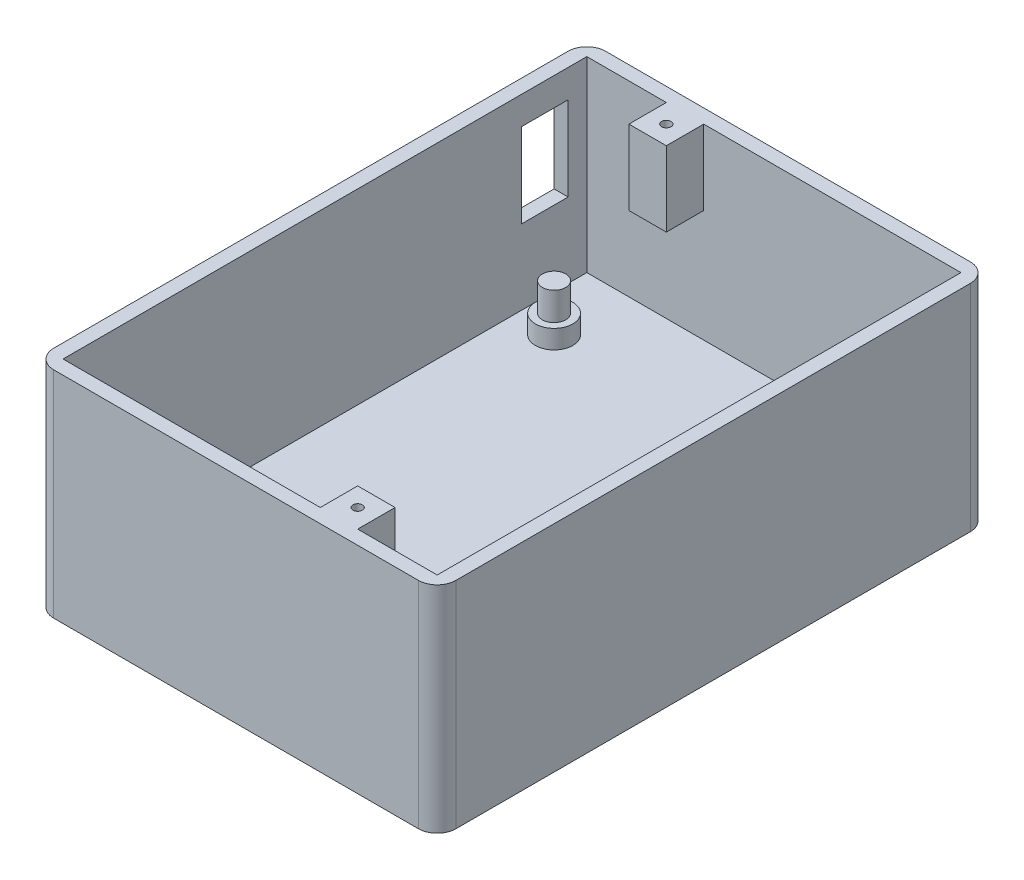
ISO-10303-21;
HEADER;
FILE_DESCRIPTION(('STEP AP214'),'2;1');
FILE_NAME('part.step','',(''),(''),'','','');
FILE_SCHEMA(('AUTOMOTIVE_DESIGN { 1 0 10303 214 1 1 1 1 }'));
ENDSEC;
DATA;
#1=APPLICATION_CONTEXT('core data for automotive mechanical design processes');
#2=APPLICATION_PROTOCOL_DEFINITION('international standard','automotive_design',2000,#1);
#3=PRODUCT_CONTEXT('',#1,'mechanical');
#4=PRODUCT('Part','Part','',(#3));
#5=PRODUCT_RELATED_PRODUCT_CATEGORY('part','',(#4));
#6=PRODUCT_DEFINITION_FORMATION('','',#4);
#7=PRODUCT_DEFINITION_CONTEXT('part definition',#1,'design');
#8=PRODUCT_DEFINITION('design','',#6,#7);
#9=PRODUCT_DEFINITION_SHAPE('','',#8);
#10=(LENGTH_UNIT() NAMED_UNIT(*) SI_UNIT(.MILLI.,.METRE.));
#11=(NAMED_UNIT(*) PLANE_ANGLE_UNIT() SI_UNIT($,.RADIAN.));
#12=(NAMED_UNIT(*) SI_UNIT($,.STERADIAN.) SOLID_ANGLE_UNIT());
#13=UNCERTAINTY_MEASURE_WITH_UNIT(LENGTH_MEASURE(1.E-05),#10,'distance_accuracy_value','');
#14=(GEOMETRIC_REPRESENTATION_CONTEXT(3) GLOBAL_UNCERTAINTY_ASSIGNED_CONTEXT((#13)) GLOBAL_UNIT_ASSIGNED_CONTEXT((#10,
#11,#12)) REPRESENTATION_CONTEXT('',''));
#15=CARTESIAN_POINT('',(0.,0.,0.));
#16=DIRECTION('',(0.,0.,1.));
#17=DIRECTION('',(1.,0.,0.));
#18=AXIS2_PLACEMENT_3D('',#15,#16,#17);
#19=CARTESIAN_POINT('',(-20.,3.,28.));
#20=DIRECTION('',(0.,0.,1.));
#21=DIRECTION('',(1.,0.,0.));
#22=AXIS2_PLACEMENT_3D('',#19,#20,#21);
#23=PLANE('',#22);
#24=DIRECTION('',(0.,-1.,0.));
#25=VECTOR('',#24,1.);
#26=CARTESIAN_POINT('',(11.5,23.,28.));
#27=LINE('',#26,#25);
#28=CARTESIAN_POINT('',(11.5,23.,28.));
#29=VERTEX_POINT('',#28);
#30=CARTESIAN_POINT('',(11.5,15.,28.));
#31=VERTEX_POINT('',#30);
#32=EDGE_CURVE('E227',#29,#31,#27,.T.);
#33=ORIENTED_EDGE('',*,*,#32,.F.);
#34=DIRECTION('',(1.,0.,0.));
#35=VECTOR('',#34,1.);
#36=CARTESIAN_POINT('',(-20.,23.,28.));
#37=LINE('',#36,#35);
#38=CARTESIAN_POINT('',(20.,23.,28.));
#39=VERTEX_POINT('',#38);
#40=EDGE_CURVE('E329',#29,#39,#37,.T.);
#41=ORIENTED_EDGE('',*,*,#40,.T.);
#42=DIRECTION('',(0.,1.,0.));
#43=VECTOR('',#42,1.);
#44=CARTESIAN_POINT('',(20.,3.,28.));
#45=LINE('',#44,#43);
#46=CARTESIAN_POINT('',(20.,3.,28.));
#47=VERTEX_POINT('',#46);
#48=EDGE_CURVE('E343',#47,#39,#45,.T.);
#49=ORIENTED_EDGE('',*,*,#48,.F.);
#50=DIRECTION('',(1.,0.,0.));
#51=VECTOR('',#50,1.);
#52=CARTESIAN_POINT('',(-20.,3.,28.));
#53=LINE('',#52,#51);
#54=CARTESIAN_POINT('',(-20.,3.,28.));
#55=VERTEX_POINT('',#54);
#56=EDGE_CURVE('E317',#55,#47,#53,.T.);
#57=ORIENTED_EDGE('',*,*,#56,.F.);
#58=DIRECTION('',(0.,1.,0.));
#59=VECTOR('',#58,1.);
#60=CARTESIAN_POINT('',(-20.,3.,28.));
#61=LINE('',#60,#59);
#62=CARTESIAN_POINT('',(-20.,23.,28.));
#63=VERTEX_POINT('',#62);
#64=EDGE_CURVE('E327',#55,#63,#61,.T.);
#65=ORIENTED_EDGE('',*,*,#64,.T.);
#66=CARTESIAN_POINT('',(7.5,23.,28.));
#67=VERTEX_POINT('',#66);
#68=EDGE_CURVE('E330',#63,#67,#37,.T.);
#69=ORIENTED_EDGE('',*,*,#68,.T.);
#70=DIRECTION('',(0.,1.,0.));
#71=VECTOR('',#70,1.);
#72=CARTESIAN_POINT('',(7.5,23.,28.));
#73=LINE('',#72,#71);
#74=CARTESIAN_POINT('',(7.5,15.,28.));
#75=VERTEX_POINT('',#74);
#76=EDGE_CURVE('E234',#75,#67,#73,.T.);
#77=ORIENTED_EDGE('',*,*,#76,.F.);
#78=DIRECTION('',(-1.,0.,0.));
#79=VECTOR('',#78,1.);
#80=CARTESIAN_POINT('',(11.5,15.,28.));
#81=LINE('',#80,#79);
#82=EDGE_CURVE('E243',#31,#75,#81,.T.);
#83=ORIENTED_EDGE('',*,*,#82,.F.);
#84=EDGE_LOOP('',(#33,#41,#49,#57,#65,#69,#77,#83));
#85=FACE_BOUND('',#84,.T.);
#86=ADVANCED_FACE('F32',(#85),#23,.F.);
#87=CARTESIAN_POINT('',(-20.,3.,-28.));
#88=DIRECTION('',(0.,0.,-1.));
#89=DIRECTION('',(-1.,0.,0.));
#90=AXIS2_PLACEMENT_3D('',#87,#88,#89);
#91=PLANE('',#90);
#92=DIRECTION('',(0.,-1.,0.));
#93=VECTOR('',#92,1.);
#94=CARTESIAN_POINT('',(-11.5,23.,-28.));
#95=LINE('',#94,#93);
#96=CARTESIAN_POINT('',(-11.5,23.,-28.));
#97=VERTEX_POINT('',#96);
#98=CARTESIAN_POINT('',(-11.5,15.,-28.));
#99=VERTEX_POINT('',#98);
#100=EDGE_CURVE('E259',#97,#99,#95,.T.);
#101=ORIENTED_EDGE('',*,*,#100,.F.);
#102=DIRECTION('',(-1.,0.,0.));
#103=VECTOR('',#102,1.);
#104=CARTESIAN_POINT('',(-20.,23.,-28.));
#105=LINE('',#104,#103);
#106=CARTESIAN_POINT('',(-20.,23.,-28.));
#107=VERTEX_POINT('',#106);
#108=EDGE_CURVE('E335',#97,#107,#105,.T.);
#109=ORIENTED_EDGE('',*,*,#108,.T.);
#110=DIRECTION('',(0.,1.,0.));
#111=VECTOR('',#110,1.);
#112=CARTESIAN_POINT('',(-20.,3.,-28.));
#113=LINE('',#112,#111);
#114=CARTESIAN_POINT('',(-20.,3.,-28.));
#115=VERTEX_POINT('',#114);
#116=EDGE_CURVE('E337',#115,#107,#113,.T.);
#117=ORIENTED_EDGE('',*,*,#116,.F.);
#118=DIRECTION('',(-1.,0.,0.));
#119=VECTOR('',#118,1.);
#120=CARTESIAN_POINT('',(-20.,3.,-28.));
#121=LINE('',#120,#119);
#122=CARTESIAN_POINT('',(20.,3.,-28.));
#123=VERTEX_POINT('',#122);
#124=EDGE_CURVE('E324',#123,#115,#121,.T.);
#125=ORIENTED_EDGE('',*,*,#124,.F.);
#126=DIRECTION('',(0.,1.,0.));
#127=VECTOR('',#126,1.);
#128=CARTESIAN_POINT('',(20.,3.,-28.));
#129=LINE('',#128,#127);
#130=CARTESIAN_POINT('',(20.,23.,-28.));
#131=VERTEX_POINT('',#130);
#132=EDGE_CURVE('E341',#123,#131,#129,.T.);
#133=ORIENTED_EDGE('',*,*,#132,.T.);
#134=CARTESIAN_POINT('',(-7.5,23.,-28.));
#135=VERTEX_POINT('',#134);
#136=EDGE_CURVE('E318',#131,#135,#105,.T.);
#137=ORIENTED_EDGE('',*,*,#136,.T.);
#138=DIRECTION('',(0.,1.,0.));
#139=VECTOR('',#138,1.);
#140=CARTESIAN_POINT('',(-7.5,23.,-28.));
#141=LINE('',#140,#139);
#142=CARTESIAN_POINT('',(-7.5,15.,-28.));
#143=VERTEX_POINT('',#142);
#144=EDGE_CURVE('E264',#143,#135,#141,.T.);
#145=ORIENTED_EDGE('',*,*,#144,.F.);
#146=DIRECTION('',(1.,0.,0.));
#147=VECTOR('',#146,1.);
#148=CARTESIAN_POINT('',(-11.5,15.,-28.));
#149=LINE('',#148,#147);
#150=EDGE_CURVE('E273',#99,#143,#149,.T.);
#151=ORIENTED_EDGE('',*,*,#150,.F.);
#152=EDGE_LOOP('',(#101,#109,#117,#125,#133,#137,#145,#151));
#153=FACE_BOUND('',#152,.T.);
#154=ADVANCED_FACE('F449',(#153),#91,.F.);
#155=CARTESIAN_POINT('',(19.5,23.,-27.5));
#156=DIRECTION('',(0.,-1.,0.));
#157=DIRECTION('',(0.,0.,-1.));
#158=AXIS2_PLACEMENT_3D('',#155,#156,#157);
#159=CYLINDRICAL_SURFACE('',#158,2.);
#160=CARTESIAN_POINT('',(19.5,0.,-27.5));
#161=DIRECTION('',(0.,1.,0.));
#162=DIRECTION('',(0.,0.,-1.));
#163=AXIS2_PLACEMENT_3D('',#160,#161,#162);
#164=CIRCLE('',#163,2.);
#165=CARTESIAN_POINT('',(21.5,0.,-27.5));
#166=VERTEX_POINT('',#165);
#167=CARTESIAN_POINT('',(19.5,0.,-29.5));
#168=VERTEX_POINT('',#167);
#169=EDGE_CURVE('E340',#166,#168,#164,.T.);
#170=ORIENTED_EDGE('',*,*,#169,.T.);
#171=DIRECTION('',(0.,-1.,0.));
#172=VECTOR('',#171,1.);
#173=CARTESIAN_POINT('',(19.5,23.,-29.5));
#174=LINE('',#173,#172);
#175=CARTESIAN_POINT('',(19.5,23.,-29.5));
#176=VERTEX_POINT('',#175);
#177=EDGE_CURVE('E11',#176,#168,#174,.T.);
#178=ORIENTED_EDGE('',*,*,#177,.F.);
#179=CARTESIAN_POINT('',(19.5,23.,-27.5));
#180=DIRECTION('',(0.,1.,0.));
#181=DIRECTION('',(0.,0.,-1.));
#182=AXIS2_PLACEMENT_3D('',#179,#180,#181);
#183=CIRCLE('',#182,2.);
#184=CARTESIAN_POINT('',(21.5,23.,-27.5));
#185=VERTEX_POINT('',#184);
#186=EDGE_CURVE('E348',#185,#176,#183,.T.);
#187=ORIENTED_EDGE('',*,*,#186,.F.);
#188=DIRECTION('',(0.,-1.,0.));
#189=VECTOR('',#188,1.);
#190=CARTESIAN_POINT('',(21.5,23.,-27.5));
#191=LINE('',#190,#189);
#192=EDGE_CURVE('E366',#185,#166,#191,.T.);
#193=ORIENTED_EDGE('',*,*,#192,.T.);
#194=EDGE_LOOP('',(#170,#178,#187,#193));
#195=FACE_BOUND('',#194,.T.);
#196=ADVANCED_FACE('F34',(#195),#159,.T.);
#197=CARTESIAN_POINT('',(-19.5,23.,-29.5));
#198=DIRECTION('',(0.,0.,1.));
#199=DIRECTION('',(1.,0.,0.));
#200=AXIS2_PLACEMENT_3D('',#197,#198,#199);
#201=PLANE('',#200);
#202=DIRECTION('',(-1.,0.,0.));
#203=VECTOR('',#202,1.);
#204=CARTESIAN_POINT('',(-19.5,0.,-29.5));
#205=LINE('',#204,#203);
#206=CARTESIAN_POINT('',(-19.5,0.,-29.5));
#207=VERTEX_POINT('',#206);
#208=EDGE_CURVE('E369',#168,#207,#205,.T.);
#209=ORIENTED_EDGE('',*,*,#208,.T.);
#210=DIRECTION('',(0.,-1.,0.));
#211=VECTOR('',#210,1.);
#212=CARTESIAN_POINT('',(-19.5,23.,-29.5));
#213=LINE('',#212,#211);
#214=CARTESIAN_POINT('',(-19.5,23.,-29.5));
#215=VERTEX_POINT('',#214);
#216=EDGE_CURVE('E40',#215,#207,#213,.T.);
#217=ORIENTED_EDGE('',*,*,#216,.F.);
#218=DIRECTION('',(-1.,0.,0.));
#219=VECTOR('',#218,1.);
#220=CARTESIAN_POINT('',(-19.5,23.,-29.5));
#221=LINE('',#220,#219);
#222=EDGE_CURVE('E351',#176,#215,#221,.T.);
#223=ORIENTED_EDGE('',*,*,#222,.F.);
#224=ORIENTED_EDGE('',*,*,#177,.T.);
#225=EDGE_LOOP('',(#209,#217,#223,#224));
#226=FACE_BOUND('',#225,.T.);
#227=ADVANCED_FACE('F426',(#226),#201,.F.);
#228=CARTESIAN_POINT('',(-19.5,23.,-27.5));
#229=DIRECTION('',(0.,-1.,0.));
#230=DIRECTION('',(0.,0.,-1.));
#231=AXIS2_PLACEMENT_3D('',#228,#229,#230);
#232=CYLINDRICAL_SURFACE('',#231,2.);
#233=CARTESIAN_POINT('',(-19.5,0.,-27.5));
#234=DIRECTION('',(0.,1.,0.));
#235=DIRECTION('',(0.,0.,1.));
#236=AXIS2_PLACEMENT_3D('',#233,#234,#235);
#237=CIRCLE('',#236,2.);
#238=CARTESIAN_POINT('',(-21.5,0.,-27.5));
#239=VERTEX_POINT('',#238);
#240=EDGE_CURVE('E371',#207,#239,#237,.T.);
#241=ORIENTED_EDGE('',*,*,#240,.T.);
#242=DIRECTION('',(0.,-1.,0.));
#243=VECTOR('',#242,1.);
#244=CARTESIAN_POINT('',(-21.5,23.,-27.5));
#245=LINE('',#244,#243);
#246=CARTESIAN_POINT('',(-21.5,23.,-27.5));
#247=VERTEX_POINT('',#246);
#248=EDGE_CURVE('E396',#247,#239,#245,.T.);
#249=ORIENTED_EDGE('',*,*,#248,.F.);
#250=CARTESIAN_POINT('',(-19.5,23.,-27.5));
#251=DIRECTION('',(0.,1.,0.));
#252=DIRECTION('',(0.,0.,1.));
#253=AXIS2_PLACEMENT_3D('',#250,#251,#252);
#254=CIRCLE('',#253,2.);
#255=EDGE_CURVE('E354',#215,#247,#254,.T.);
#256=ORIENTED_EDGE('',*,*,#255,.F.);
#257=ORIENTED_EDGE('',*,*,#216,.T.);
#258=EDGE_LOOP('',(#241,#249,#256,#257));
#259=FACE_BOUND('',#258,.T.);
#260=ADVANCED_FACE('F403',(#259),#232,.T.);
#261=CARTESIAN_POINT('',(-21.5,23.,-27.5));
#262=DIRECTION('',(1.,0.,0.));
#263=DIRECTION('',(0.,0.,-1.));
#264=AXIS2_PLACEMENT_3D('',#261,#262,#263);
#265=PLANE('',#264);
#266=DIRECTION('',(0.,1.,0.));
#267=VECTOR('',#266,1.);
#268=CARTESIAN_POINT('',(-21.5,20.,-21.));
#269=LINE('',#268,#267);
#270=CARTESIAN_POINT('',(-21.5,11.,-21.));
#271=VERTEX_POINT('',#270);
#272=CARTESIAN_POINT('',(-21.5,20.,-21.));
#273=VERTEX_POINT('',#272);
#274=EDGE_CURVE('E812',#271,#273,#269,.T.);
#275=ORIENTED_EDGE('',*,*,#274,.F.);
#276=DIRECTION('',(0.,0.,1.));
#277=VECTOR('',#276,1.);
#278=CARTESIAN_POINT('',(-21.5,11.,-26.));
#279=LINE('',#278,#277);
#280=CARTESIAN_POINT('',(-21.5,11.,-26.));
#281=VERTEX_POINT('',#280);
#282=EDGE_CURVE('E814',#281,#271,#279,.T.);
#283=ORIENTED_EDGE('',*,*,#282,.F.);
#284=DIRECTION('',(0.,-1.,0.));
#285=VECTOR('',#284,1.);
#286=CARTESIAN_POINT('',(-21.5,20.,-26.));
#287=LINE('',#286,#285);
#288=CARTESIAN_POINT('',(-21.5,20.,-26.));
#289=VERTEX_POINT('',#288);
#290=EDGE_CURVE('E213',#289,#281,#287,.T.);
#291=ORIENTED_EDGE('',*,*,#290,.F.);
#292=DIRECTION('',(0.,0.,-1.));
#293=VECTOR('',#292,1.);
#294=CARTESIAN_POINT('',(-21.5,20.,-26.));
#295=LINE('',#294,#293);
#296=EDGE_CURVE('E47',#273,#289,#295,.T.);
#297=ORIENTED_EDGE('',*,*,#296,.F.);
#298=EDGE_LOOP('',(#275,#283,#291,#297));
#299=FACE_BOUND('',#298,.T.);
#300=DIRECTION('',(0.,0.,1.));
#301=VECTOR('',#300,1.);
#302=CARTESIAN_POINT('',(-21.5,0.,-27.5));
#303=LINE('',#302,#301);
#304=CARTESIAN_POINT('',(-21.5,0.,27.5));
#305=VERTEX_POINT('',#304);
#306=EDGE_CURVE('E373',#239,#305,#303,.T.);
#307=ORIENTED_EDGE('',*,*,#306,.T.);
#308=DIRECTION('',(0.,-1.,0.));
#309=VECTOR('',#308,1.);
#310=CARTESIAN_POINT('',(-21.5,23.,27.5));
#311=LINE('',#310,#309);
#312=CARTESIAN_POINT('',(-21.5,23.,27.5));
#313=VERTEX_POINT('',#312);
#314=EDGE_CURVE('E393',#313,#305,#311,.T.);
#315=ORIENTED_EDGE('',*,*,#314,.F.);
#316=DIRECTION('',(0.,0.,1.));
#317=VECTOR('',#316,1.);
#318=CARTESIAN_POINT('',(-21.5,23.,-27.5));
#319=LINE('',#318,#317);
#320=EDGE_CURVE('E356',#247,#313,#319,.T.);
#321=ORIENTED_EDGE('',*,*,#320,.F.);
#322=ORIENTED_EDGE('',*,*,#248,.T.);
#323=EDGE_LOOP('',(#307,#315,#321,#322));
#324=FACE_BOUND('',#323,.T.);
#325=ADVANCED_FACE('F414',(#299,#324),#265,.F.);
#326=CARTESIAN_POINT('',(-19.5,23.,27.5));
#327=DIRECTION('',(0.,-1.,0.));
#328=DIRECTION('',(0.,0.,-1.));
#329=AXIS2_PLACEMENT_3D('',#326,#327,#328);
#330=CYLINDRICAL_SURFACE('',#329,2.);
#331=CARTESIAN_POINT('',(-19.5,0.,27.5));
#332=DIRECTION('',(0.,1.,0.));
#333=DIRECTION('',(0.,0.,-1.));
#334=AXIS2_PLACEMENT_3D('',#331,#332,#333);
#335=CIRCLE('',#334,2.);
#336=CARTESIAN_POINT('',(-19.5,0.,29.5));
#337=VERTEX_POINT('',#336);
#338=EDGE_CURVE('E375',#305,#337,#335,.T.);
#339=ORIENTED_EDGE('',*,*,#338,.T.);
#340=DIRECTION('',(0.,-1.,0.));
#341=VECTOR('',#340,1.);
#342=CARTESIAN_POINT('',(-19.5,23.,29.5));
#343=LINE('',#342,#341);
#344=CARTESIAN_POINT('',(-19.5,23.,29.5));
#345=VERTEX_POINT('',#344);
#346=EDGE_CURVE('E390',#345,#337,#343,.T.);
#347=ORIENTED_EDGE('',*,*,#346,.F.);
#348=CARTESIAN_POINT('',(-19.5,23.,27.5));
#349=DIRECTION('',(0.,1.,0.));
#350=DIRECTION('',(0.,0.,-1.));
#351=AXIS2_PLACEMENT_3D('',#348,#349,#350);
#352=CIRCLE('',#351,2.);
#353=EDGE_CURVE('E358',#313,#345,#352,.T.);
#354=ORIENTED_EDGE('',*,*,#353,.F.);
#355=ORIENTED_EDGE('',*,*,#314,.T.);
#356=EDGE_LOOP('',(#339,#347,#354,#355));
#357=FACE_BOUND('',#356,.T.);
#358=ADVANCED_FACE('F418',(#357),#330,.T.);
#359=CARTESIAN_POINT('',(-19.5,23.,29.5));
#360=DIRECTION('',(0.,0.,-1.));
#361=DIRECTION('',(-1.,0.,0.));
#362=AXIS2_PLACEMENT_3D('',#359,#360,#361);
#363=PLANE('',#362);
#364=DIRECTION('',(1.,0.,0.));
#365=VECTOR('',#364,1.);
#366=CARTESIAN_POINT('',(-19.5,0.,29.5));
#367=LINE('',#366,#365);
#368=CARTESIAN_POINT('',(19.5,0.,29.5));
#369=VERTEX_POINT('',#368);
#370=EDGE_CURVE('E377',#337,#369,#367,.T.);
#371=ORIENTED_EDGE('',*,*,#370,.T.);
#372=DIRECTION('',(0.,-1.,0.));
#373=VECTOR('',#372,1.);
#374=CARTESIAN_POINT('',(19.5,23.,29.5));
#375=LINE('',#374,#373);
#376=CARTESIAN_POINT('',(19.5,23.,29.5));
#377=VERTEX_POINT('',#376);
#378=EDGE_CURVE('E387',#377,#369,#375,.T.);
#379=ORIENTED_EDGE('',*,*,#378,.F.);
#380=DIRECTION('',(1.,0.,0.));
#381=VECTOR('',#380,1.);
#382=CARTESIAN_POINT('',(-19.5,23.,29.5));
#383=LINE('',#382,#381);
#384=EDGE_CURVE('E360',#345,#377,#383,.T.);
#385=ORIENTED_EDGE('',*,*,#384,.F.);
#386=ORIENTED_EDGE('',*,*,#346,.T.);
#387=EDGE_LOOP('',(#371,#379,#385,#386));
#388=FACE_BOUND('',#387,.T.);
#389=ADVANCED_FACE('F439',(#388),#363,.F.);
#390=CARTESIAN_POINT('',(19.5,23.,27.5));
#391=DIRECTION('',(0.,-1.,0.));
#392=DIRECTION('',(0.,0.,-1.));
#393=AXIS2_PLACEMENT_3D('',#390,#391,#392);
#394=CYLINDRICAL_SURFACE('',#393,2.);
#395=CARTESIAN_POINT('',(19.5,0.,27.5));
#396=DIRECTION('',(0.,1.,0.));
#397=DIRECTION('',(0.,0.,1.));
#398=AXIS2_PLACEMENT_3D('',#395,#396,#397);
#399=CIRCLE('',#398,2.);
#400=CARTESIAN_POINT('',(21.5,0.,27.5));
#401=VERTEX_POINT('',#400);
#402=EDGE_CURVE('E379',#369,#401,#399,.T.);
#403=ORIENTED_EDGE('',*,*,#402,.T.);
#404=DIRECTION('',(0.,-1.,0.));
#405=VECTOR('',#404,1.);
#406=CARTESIAN_POINT('',(21.5,23.,27.5));
#407=LINE('',#406,#405);
#408=CARTESIAN_POINT('',(21.5,23.,27.5));
#409=VERTEX_POINT('',#408);
#410=EDGE_CURVE('E384',#409,#401,#407,.T.);
#411=ORIENTED_EDGE('',*,*,#410,.F.);
#412=CARTESIAN_POINT('',(19.5,23.,27.5));
#413=DIRECTION('',(0.,1.,0.));
#414=DIRECTION('',(0.,0.,1.));
#415=AXIS2_PLACEMENT_3D('',#412,#413,#414);
#416=CIRCLE('',#415,2.);
#417=EDGE_CURVE('E362',#377,#409,#416,.T.);
#418=ORIENTED_EDGE('',*,*,#417,.F.);
#419=ORIENTED_EDGE('',*,*,#378,.T.);
#420=EDGE_LOOP('',(#403,#411,#418,#419));
#421=FACE_BOUND('',#420,.T.);
#422=ADVANCED_FACE('F437',(#421),#394,.T.);
#423=CARTESIAN_POINT('',(21.5,23.,-27.5));
#424=DIRECTION('',(-1.,0.,0.));
#425=DIRECTION('',(0.,0.,1.));
#426=AXIS2_PLACEMENT_3D('',#423,#424,#425);
#427=PLANE('',#426);
#428=DIRECTION('',(0.,0.,-1.));
#429=VECTOR('',#428,1.);
#430=CARTESIAN_POINT('',(21.5,0.,-27.5));
#431=LINE('',#430,#429);
#432=EDGE_CURVE('E352',#401,#166,#431,.T.);
#433=ORIENTED_EDGE('',*,*,#432,.T.);
#434=ORIENTED_EDGE('',*,*,#192,.F.);
#435=DIRECTION('',(0.,0.,-1.));
#436=VECTOR('',#435,1.);
#437=CARTESIAN_POINT('',(21.5,23.,-27.5));
#438=LINE('',#437,#436);
#439=EDGE_CURVE('E364',#409,#185,#438,.T.);
#440=ORIENTED_EDGE('',*,*,#439,.F.);
#441=ORIENTED_EDGE('',*,*,#410,.T.);
#442=EDGE_LOOP('',(#433,#434,#440,#441));
#443=FACE_BOUND('',#442,.T.);
#444=ADVANCED_FACE('F432',(#443),#427,.F.);
#445=CARTESIAN_POINT('',(19.5,23.,-27.5));
#446=DIRECTION('',(0.,-1.,0.));
#447=DIRECTION('',(0.,0.,-1.));
#448=AXIS2_PLACEMENT_3D('',#445,#446,#447);
#449=PLANE('',#448);
#450=CARTESIAN_POINT('',(9.5,23.,26.));
#451=DIRECTION('',(0.,1.,0.));
#452=DIRECTION('',(0.,0.,1.));
#453=AXIS2_PLACEMENT_3D('',#450,#451,#452);
#454=CIRCLE('',#453,0.500000000000001);
#455=CARTESIAN_POINT('',(9.5,23.,26.5));
#456=VERTEX_POINT('',#455);
#457=EDGE_CURVE('E221',#456,#456,#454,.T.);
#458=ORIENTED_EDGE('',*,*,#457,.F.);
#459=EDGE_LOOP('',(#458));
#460=FACE_BOUND('',#459,.T.);
#461=CARTESIAN_POINT('',(-9.5,23.,-26.));
#462=DIRECTION('',(0.,1.,0.));
#463=DIRECTION('',(0.,0.,1.));
#464=AXIS2_PLACEMENT_3D('',#461,#462,#463);
#465=CIRCLE('',#464,0.500000000000001);
#466=CARTESIAN_POINT('',(-9.5,23.,-25.5));
#467=VERTEX_POINT('',#466);
#468=EDGE_CURVE('E220',#467,#467,#465,.T.);
#469=ORIENTED_EDGE('',*,*,#468,.F.);
#470=EDGE_LOOP('',(#469));
#471=FACE_BOUND('',#470,.T.);
#472=ORIENTED_EDGE('',*,*,#68,.F.);
#473=DIRECTION('',(0.,0.,1.));
#474=VECTOR('',#473,1.);
#475=CARTESIAN_POINT('',(-20.,23.,-28.));
#476=LINE('',#475,#474);
#477=EDGE_CURVE('E311',#107,#63,#476,.T.);
#478=ORIENTED_EDGE('',*,*,#477,.F.);
#479=ORIENTED_EDGE('',*,*,#108,.F.);
#480=DIRECTION('',(0.,0.,-1.));
#481=VECTOR('',#480,1.);
#482=CARTESIAN_POINT('',(-11.5,23.,-24.));
#483=LINE('',#482,#481);
#484=CARTESIAN_POINT('',(-11.5,23.,-24.));
#485=VERTEX_POINT('',#484);
#486=EDGE_CURVE('E270',#485,#97,#483,.T.);
#487=ORIENTED_EDGE('',*,*,#486,.F.);
#488=DIRECTION('',(-1.,0.,0.));
#489=VECTOR('',#488,1.);
#490=CARTESIAN_POINT('',(-11.5,23.,-24.));
#491=LINE('',#490,#489);
#492=CARTESIAN_POINT('',(-7.5,23.,-24.));
#493=VERTEX_POINT('',#492);
#494=EDGE_CURVE('E268',#493,#485,#491,.T.);
#495=ORIENTED_EDGE('',*,*,#494,.F.);
#496=DIRECTION('',(0.,0.,-1.));
#497=VECTOR('',#496,1.);
#498=CARTESIAN_POINT('',(-7.5,23.,-24.));
#499=LINE('',#498,#497);
#500=EDGE_CURVE('E280',#493,#135,#499,.T.);
#501=ORIENTED_EDGE('',*,*,#500,.T.);
#502=ORIENTED_EDGE('',*,*,#136,.F.);
#503=DIRECTION('',(0.,0.,-1.));
#504=VECTOR('',#503,1.);
#505=CARTESIAN_POINT('',(20.,23.,-28.));
#506=LINE('',#505,#504);
#507=EDGE_CURVE('E332',#39,#131,#506,.T.);
#508=ORIENTED_EDGE('',*,*,#507,.F.);
#509=ORIENTED_EDGE('',*,*,#40,.F.);
#510=DIRECTION('',(0.,0.,1.));
#511=VECTOR('',#510,1.);
#512=CARTESIAN_POINT('',(11.5,23.,24.));
#513=LINE('',#512,#511);
#514=CARTESIAN_POINT('',(11.5,23.,24.));
#515=VERTEX_POINT('',#514);
#516=EDGE_CURVE('E240',#515,#29,#513,.T.);
#517=ORIENTED_EDGE('',*,*,#516,.F.);
#518=DIRECTION('',(1.,0.,0.));
#519=VECTOR('',#518,1.);
#520=CARTESIAN_POINT('',(11.5,23.,24.));
#521=LINE('',#520,#519);
#522=CARTESIAN_POINT('',(7.5,23.,24.));
#523=VERTEX_POINT('',#522);
#524=EDGE_CURVE('E238',#523,#515,#521,.T.);
#525=ORIENTED_EDGE('',*,*,#524,.F.);
#526=DIRECTION('',(0.,0.,1.));
#527=VECTOR('',#526,1.);
#528=CARTESIAN_POINT('',(7.5,23.,24.));
#529=LINE('',#528,#527);
#530=EDGE_CURVE('E250',#523,#67,#529,.T.);
#531=ORIENTED_EDGE('',*,*,#530,.T.);
#532=EDGE_LOOP('',(#472,#478,#479,#487,#495,#501,#502,#508,#509,#517,#525,#531));
#533=FACE_BOUND('',#532,.T.);
#534=ORIENTED_EDGE('',*,*,#186,.T.);
#535=ORIENTED_EDGE('',*,*,#222,.T.);
#536=ORIENTED_EDGE('',*,*,#255,.T.);
#537=ORIENTED_EDGE('',*,*,#320,.T.);
#538=ORIENTED_EDGE('',*,*,#353,.T.);
#539=ORIENTED_EDGE('',*,*,#384,.T.);
#540=ORIENTED_EDGE('',*,*,#417,.T.);
#541=ORIENTED_EDGE('',*,*,#439,.T.);
#542=EDGE_LOOP('',(#534,#535,#536,#537,#538,#539,#540,#541));
#543=FACE_BOUND('',#542,.T.);
#544=ADVANCED_FACE('F422',(#460,#471,#533,#543),#449,.F.);
#545=CARTESIAN_POINT('',(19.5,0.,-27.5));
#546=DIRECTION('',(0.,-1.,0.));
#547=DIRECTION('',(0.,0.,-1.));
#548=AXIS2_PLACEMENT_3D('',#545,#546,#547);
#549=PLANE('',#548);
#550=ORIENTED_EDGE('',*,*,#169,.F.);
#551=ORIENTED_EDGE('',*,*,#432,.F.);
#552=ORIENTED_EDGE('',*,*,#402,.F.);
#553=ORIENTED_EDGE('',*,*,#370,.F.);
#554=ORIENTED_EDGE('',*,*,#338,.F.);
#555=ORIENTED_EDGE('',*,*,#306,.F.);
#556=ORIENTED_EDGE('',*,*,#240,.F.);
#557=ORIENTED_EDGE('',*,*,#208,.F.);
#558=EDGE_LOOP('',(#550,#551,#552,#553,#554,#555,#556,#557));
#559=FACE_BOUND('',#558,.T.);
#560=ADVANCED_FACE('F409',(#559),#549,.T.);
#561=CARTESIAN_POINT('',(-20.,3.,-28.));
#562=DIRECTION('',(-1.,0.,0.));
#563=DIRECTION('',(0.,0.,1.));
#564=AXIS2_PLACEMENT_3D('',#561,#562,#563);
#565=PLANE('',#564);
#566=DIRECTION('',(0.,1.,0.));
#567=VECTOR('',#566,1.);
#568=CARTESIAN_POINT('',(-20.,20.,-26.));
#569=LINE('',#568,#567);
#570=CARTESIAN_POINT('',(-20.,11.,-26.));
#571=VERTEX_POINT('',#570);
#572=CARTESIAN_POINT('',(-20.,20.,-26.));
#573=VERTEX_POINT('',#572);
#574=EDGE_CURVE('E204',#571,#573,#569,.T.);
#575=ORIENTED_EDGE('',*,*,#574,.F.);
#576=DIRECTION('',(0.,0.,-1.));
#577=VECTOR('',#576,1.);
#578=CARTESIAN_POINT('',(-20.,11.,-26.));
#579=LINE('',#578,#577);
#580=CARTESIAN_POINT('',(-20.,11.,-21.));
#581=VERTEX_POINT('',#580);
#582=EDGE_CURVE('E55',#581,#571,#579,.T.);
#583=ORIENTED_EDGE('',*,*,#582,.F.);
#584=DIRECTION('',(0.,-1.,0.));
#585=VECTOR('',#584,1.);
#586=CARTESIAN_POINT('',(-20.,20.,-21.));
#587=LINE('',#586,#585);
#588=CARTESIAN_POINT('',(-20.,20.,-21.));
#589=VERTEX_POINT('',#588);
#590=EDGE_CURVE('E211',#589,#581,#587,.T.);
#591=ORIENTED_EDGE('',*,*,#590,.F.);
#592=DIRECTION('',(0.,0.,1.));
#593=VECTOR('',#592,1.);
#594=CARTESIAN_POINT('',(-20.,20.,-26.));
#595=LINE('',#594,#593);
#596=EDGE_CURVE('E195',#573,#589,#595,.T.);
#597=ORIENTED_EDGE('',*,*,#596,.F.);
#598=EDGE_LOOP('',(#575,#583,#591,#597));
#599=FACE_BOUND('',#598,.T.);
#600=ORIENTED_EDGE('',*,*,#477,.T.);
#601=ORIENTED_EDGE('',*,*,#64,.F.);
#602=DIRECTION('',(0.,0.,1.));
#603=VECTOR('',#602,1.);
#604=CARTESIAN_POINT('',(-20.,3.,-28.));
#605=LINE('',#604,#603);
#606=EDGE_CURVE('E314',#115,#55,#605,.T.);
#607=ORIENTED_EDGE('',*,*,#606,.F.);
#608=ORIENTED_EDGE('',*,*,#116,.T.);
#609=EDGE_LOOP('',(#600,#601,#607,#608));
#610=FACE_BOUND('',#609,.T.);
#611=ADVANCED_FACE('F208',(#599,#610),#565,.F.);
#612=CARTESIAN_POINT('',(20.,3.,-28.));
#613=DIRECTION('',(1.,0.,0.));
#614=DIRECTION('',(0.,0.,-1.));
#615=AXIS2_PLACEMENT_3D('',#612,#613,#614);
#616=PLANE('',#615);
#617=ORIENTED_EDGE('',*,*,#507,.T.);
#618=ORIENTED_EDGE('',*,*,#132,.F.);
#619=DIRECTION('',(0.,0.,-1.));
#620=VECTOR('',#619,1.);
#621=CARTESIAN_POINT('',(20.,3.,-28.));
#622=LINE('',#621,#620);
#623=EDGE_CURVE('E321',#47,#123,#622,.T.);
#624=ORIENTED_EDGE('',*,*,#623,.F.);
#625=ORIENTED_EDGE('',*,*,#48,.T.);
#626=EDGE_LOOP('',(#617,#618,#624,#625));
#627=FACE_BOUND('',#626,.T.);
#628=ADVANCED_FACE('F460',(#627),#616,.F.);
#629=CARTESIAN_POINT('',(0.,3.,0.));
#630=DIRECTION('',(0.,1.,0.));
#631=DIRECTION('',(0.,0.,1.));
#632=AXIS2_PLACEMENT_3D('',#629,#630,#631);
#633=PLANE('',#632);
#634=CARTESIAN_POINT('',(2.,3.,22.5));
#635=DIRECTION('',(0.,1.,0.));
#636=DIRECTION('',(0.,0.,1.));
#637=AXIS2_PLACEMENT_3D('',#634,#635,#636);
#638=CIRCLE('',#637,2.00000000000001);
#639=CARTESIAN_POINT('',(2.,3.,24.5));
#640=VERTEX_POINT('',#639);
#641=EDGE_CURVE('E302',#640,#640,#638,.T.);
#642=ORIENTED_EDGE('',*,*,#641,.F.);
#643=EDGE_LOOP('',(#642));
#644=FACE_BOUND('',#643,.T.);
#645=CARTESIAN_POINT('',(-16.,3.,-20.5));
#646=DIRECTION('',(0.,1.,0.));
#647=DIRECTION('',(0.,0.,1.));
#648=AXIS2_PLACEMENT_3D('',#645,#646,#647);
#649=CIRCLE('',#648,2.);
#650=CARTESIAN_POINT('',(-16.,3.,-18.5));
#651=VERTEX_POINT('',#650);
#652=EDGE_CURVE('E305',#651,#651,#649,.T.);
#653=ORIENTED_EDGE('',*,*,#652,.F.);
#654=EDGE_LOOP('',(#653));
#655=FACE_BOUND('',#654,.T.);
#656=ORIENTED_EDGE('',*,*,#606,.T.);
#657=ORIENTED_EDGE('',*,*,#56,.T.);
#658=ORIENTED_EDGE('',*,*,#623,.T.);
#659=ORIENTED_EDGE('',*,*,#124,.T.);
#660=EDGE_LOOP('',(#656,#657,#658,#659));
#661=FACE_BOUND('',#660,.T.);
#662=ADVANCED_FACE('F495',(#644,#655,#661),#633,.T.);
#663=CARTESIAN_POINT('',(-16.,5.,-20.5));
#664=DIRECTION('',(0.,-1.,0.));
#665=DIRECTION('',(0.,0.,-1.));
#666=AXIS2_PLACEMENT_3D('',#663,#664,#665);
#667=CYLINDRICAL_SURFACE('',#666,2.);
#668=CARTESIAN_POINT('',(-16.,5.,-20.5));
#669=DIRECTION('',(0.,1.,0.));
#670=DIRECTION('',(0.,0.,1.));
#671=AXIS2_PLACEMENT_3D('',#668,#669,#670);
#672=CIRCLE('',#671,2.);
#673=CARTESIAN_POINT('',(-16.,5.,-18.5));
#674=VERTEX_POINT('',#673);
#675=EDGE_CURVE('E308',#674,#674,#672,.T.);
#676=ORIENTED_EDGE('',*,*,#675,.F.);
#677=EDGE_LOOP('',(#676));
#678=FACE_BOUND('',#677,.T.);
#679=ORIENTED_EDGE('',*,*,#652,.T.);
#680=EDGE_LOOP('',(#679));
#681=FACE_BOUND('',#680,.T.);
#682=ADVANCED_FACE('F502',(#678,#681),#667,.T.);
#683=CARTESIAN_POINT('',(-16.,5.,-20.5));
#684=DIRECTION('',(0.,1.,0.));
#685=DIRECTION('',(0.,0.,1.));
#686=AXIS2_PLACEMENT_3D('',#683,#684,#685);
#687=PLANE('',#686);
#688=CARTESIAN_POINT('',(-16.,5.,-20.5));
#689=DIRECTION('',(0.,1.,0.));
#690=DIRECTION('',(0.,0.,1.));
#691=AXIS2_PLACEMENT_3D('',#688,#689,#690);
#692=CIRCLE('',#691,1.25);
#693=CARTESIAN_POINT('',(-16.,5.,-19.25));
#694=VERTEX_POINT('',#693);
#695=EDGE_CURVE('E293',#694,#694,#692,.T.);
#696=ORIENTED_EDGE('',*,*,#695,.F.);
#697=EDGE_LOOP('',(#696));
#698=FACE_BOUND('',#697,.T.);
#699=ORIENTED_EDGE('',*,*,#675,.T.);
#700=EDGE_LOOP('',(#699));
#701=FACE_BOUND('',#700,.T.);
#702=ADVANCED_FACE('F510',(#698,#701),#687,.T.);
#703=CARTESIAN_POINT('',(2.,5.,22.5));
#704=DIRECTION('',(0.,-1.,0.));
#705=DIRECTION('',(0.,0.,-1.));
#706=AXIS2_PLACEMENT_3D('',#703,#704,#705);
#707=CYLINDRICAL_SURFACE('',#706,2.00000000000001);
#708=CARTESIAN_POINT('',(2.,5.,22.5));
#709=DIRECTION('',(0.,1.,0.));
#710=DIRECTION('',(0.,0.,1.));
#711=AXIS2_PLACEMENT_3D('',#708,#709,#710);
#712=CIRCLE('',#711,2.00000000000001);
#713=CARTESIAN_POINT('',(2.,5.,24.5));
#714=VERTEX_POINT('',#713);
#715=EDGE_CURVE('E299',#714,#714,#712,.T.);
#716=ORIENTED_EDGE('',*,*,#715,.F.);
#717=EDGE_LOOP('',(#716));
#718=FACE_BOUND('',#717,.T.);
#719=ORIENTED_EDGE('',*,*,#641,.T.);
#720=EDGE_LOOP('',(#719));
#721=FACE_BOUND('',#720,.T.);
#722=ADVANCED_FACE('F519',(#718,#721),#707,.T.);
#723=CARTESIAN_POINT('',(2.,5.,22.5));
#724=DIRECTION('',(0.,1.,0.));
#725=DIRECTION('',(0.,0.,1.));
#726=AXIS2_PLACEMENT_3D('',#723,#724,#725);
#727=PLANE('',#726);
#728=CARTESIAN_POINT('',(1.99999999999999,5.,22.5));
#729=DIRECTION('',(0.,1.,0.));
#730=DIRECTION('',(0.,0.,1.));
#731=AXIS2_PLACEMENT_3D('',#728,#729,#730);
#732=CIRCLE('',#731,1.25);
#733=CARTESIAN_POINT('',(1.99999999999999,5.,23.75));
#734=VERTEX_POINT('',#733);
#735=EDGE_CURVE('E289',#734,#734,#732,.T.);
#736=ORIENTED_EDGE('',*,*,#735,.F.);
#737=EDGE_LOOP('',(#736));
#738=FACE_BOUND('',#737,.T.);
#739=ORIENTED_EDGE('',*,*,#715,.T.);
#740=EDGE_LOOP('',(#739));
#741=FACE_BOUND('',#740,.T.);
#742=ADVANCED_FACE('F527',(#738,#741),#727,.T.);
#743=CARTESIAN_POINT('',(-16.,8.,-20.5));
#744=DIRECTION('',(0.,-1.,0.));
#745=DIRECTION('',(0.,0.,-1.));
#746=AXIS2_PLACEMENT_3D('',#743,#744,#745);
#747=CYLINDRICAL_SURFACE('',#746,1.25);
#748=CARTESIAN_POINT('',(-16.,8.,-20.5));
#749=DIRECTION('',(0.,1.,0.));
#750=DIRECTION('',(0.,0.,1.));
#751=AXIS2_PLACEMENT_3D('',#748,#749,#750);
#752=CIRCLE('',#751,1.25);
#753=CARTESIAN_POINT('',(-16.,8.,-19.25));
#754=VERTEX_POINT('',#753);
#755=EDGE_CURVE('E296',#754,#754,#752,.T.);
#756=ORIENTED_EDGE('',*,*,#755,.F.);
#757=EDGE_LOOP('',(#756));
#758=FACE_BOUND('',#757,.T.);
#759=ORIENTED_EDGE('',*,*,#695,.T.);
#760=EDGE_LOOP('',(#759));
#761=FACE_BOUND('',#760,.T.);
#762=ADVANCED_FACE('F534',(#758,#761),#747,.T.);
#763=CARTESIAN_POINT('',(-16.,8.,-20.5));
#764=DIRECTION('',(0.,1.,0.));
#765=DIRECTION('',(0.,0.,1.));
#766=AXIS2_PLACEMENT_3D('',#763,#764,#765);
#767=PLANE('',#766);
#768=ORIENTED_EDGE('',*,*,#755,.T.);
#769=EDGE_LOOP('',(#768));
#770=FACE_BOUND('',#769,.T.);
#771=ADVANCED_FACE('F542',(#770),#767,.T.);
#772=CARTESIAN_POINT('',(1.99999999999999,8.,22.5));
#773=DIRECTION('',(0.,-1.,0.));
#774=DIRECTION('',(0.,0.,-1.));
#775=AXIS2_PLACEMENT_3D('',#772,#773,#774);
#776=CYLINDRICAL_SURFACE('',#775,1.25);
#777=CARTESIAN_POINT('',(1.99999999999999,8.,22.5));
#778=DIRECTION('',(0.,1.,0.));
#779=DIRECTION('',(0.,0.,1.));
#780=AXIS2_PLACEMENT_3D('',#777,#778,#779);
#781=CIRCLE('',#780,1.25);
#782=CARTESIAN_POINT('',(1.99999999999999,8.,23.75));
#783=VERTEX_POINT('',#782);
#784=EDGE_CURVE('E290',#783,#783,#781,.T.);
#785=ORIENTED_EDGE('',*,*,#784,.F.);
#786=EDGE_LOOP('',(#785));
#787=FACE_BOUND('',#786,.T.);
#788=ORIENTED_EDGE('',*,*,#735,.T.);
#789=EDGE_LOOP('',(#788));
#790=FACE_BOUND('',#789,.T.);
#791=ADVANCED_FACE('F550',(#787,#790),#776,.T.);
#792=CARTESIAN_POINT('',(1.99999999999999,8.,22.5));
#793=DIRECTION('',(0.,1.,0.));
#794=DIRECTION('',(0.,0.,1.));
#795=AXIS2_PLACEMENT_3D('',#792,#793,#794);
#796=PLANE('',#795);
#797=ORIENTED_EDGE('',*,*,#784,.T.);
#798=EDGE_LOOP('',(#797));
#799=FACE_BOUND('',#798,.T.);
#800=ADVANCED_FACE('F558',(#799),#796,.T.);
#801=CARTESIAN_POINT('',(-11.5,23.,-24.));
#802=DIRECTION('',(1.,0.,0.));
#803=DIRECTION('',(0.,1.,0.));
#804=AXIS2_PLACEMENT_3D('',#801,#802,#803);
#805=PLANE('',#804);
#806=ORIENTED_EDGE('',*,*,#100,.T.);
#807=DIRECTION('',(0.,0.,-1.));
#808=VECTOR('',#807,1.);
#809=CARTESIAN_POINT('',(-11.5,15.,-24.));
#810=LINE('',#809,#808);
#811=CARTESIAN_POINT('',(-11.5,15.,-24.));
#812=VERTEX_POINT('',#811);
#813=EDGE_CURVE('E286',#812,#99,#810,.T.);
#814=ORIENTED_EDGE('',*,*,#813,.F.);
#815=DIRECTION('',(0.,-1.,0.));
#816=VECTOR('',#815,1.);
#817=CARTESIAN_POINT('',(-11.5,23.,-24.));
#818=LINE('',#817,#816);
#819=EDGE_CURVE('E260',#485,#812,#818,.T.);
#820=ORIENTED_EDGE('',*,*,#819,.F.);
#821=ORIENTED_EDGE('',*,*,#486,.T.);
#822=EDGE_LOOP('',(#806,#814,#820,#821));
#823=FACE_BOUND('',#822,.T.);
#824=ADVANCED_FACE('F566',(#823),#805,.F.);
#825=CARTESIAN_POINT('',(-11.5,15.,-24.));
#826=DIRECTION('',(0.,1.,0.));
#827=DIRECTION('',(0.,0.,1.));
#828=AXIS2_PLACEMENT_3D('',#825,#826,#827);
#829=PLANE('',#828);
#830=ORIENTED_EDGE('',*,*,#150,.T.);
#831=DIRECTION('',(0.,0.,-1.));
#832=VECTOR('',#831,1.);
#833=CARTESIAN_POINT('',(-7.5,15.,-24.));
#834=LINE('',#833,#832);
#835=CARTESIAN_POINT('',(-7.5,15.,-24.));
#836=VERTEX_POINT('',#835);
#837=EDGE_CURVE('E283',#836,#143,#834,.T.);
#838=ORIENTED_EDGE('',*,*,#837,.F.);
#839=DIRECTION('',(1.,0.,0.));
#840=VECTOR('',#839,1.);
#841=CARTESIAN_POINT('',(-11.5,15.,-24.));
#842=LINE('',#841,#840);
#843=EDGE_CURVE('E263',#812,#836,#842,.T.);
#844=ORIENTED_EDGE('',*,*,#843,.F.);
#845=ORIENTED_EDGE('',*,*,#813,.T.);
#846=EDGE_LOOP('',(#830,#838,#844,#845));
#847=FACE_BOUND('',#846,.T.);
#848=ADVANCED_FACE('F575',(#847),#829,.F.);
#849=CARTESIAN_POINT('',(-7.5,23.,-24.));
#850=DIRECTION('',(-1.,0.,0.));
#851=DIRECTION('',(0.,-1.,0.));
#852=AXIS2_PLACEMENT_3D('',#849,#850,#851);
#853=PLANE('',#852);
#854=ORIENTED_EDGE('',*,*,#144,.T.);
#855=ORIENTED_EDGE('',*,*,#500,.F.);
#856=DIRECTION('',(0.,1.,0.));
#857=VECTOR('',#856,1.);
#858=CARTESIAN_POINT('',(-7.5,23.,-24.));
#859=LINE('',#858,#857);
#860=EDGE_CURVE('E266',#836,#493,#859,.T.);
#861=ORIENTED_EDGE('',*,*,#860,.F.);
#862=ORIENTED_EDGE('',*,*,#837,.T.);
#863=EDGE_LOOP('',(#854,#855,#861,#862));
#864=FACE_BOUND('',#863,.T.);
#865=ADVANCED_FACE('F583',(#864),#853,.F.);
#866=CARTESIAN_POINT('',(0.,0.,-24.));
#867=DIRECTION('',(0.,0.,1.));
#868=DIRECTION('',(1.,0.,0.));
#869=AXIS2_PLACEMENT_3D('',#866,#867,#868);
#870=PLANE('',#869);
#871=ORIENTED_EDGE('',*,*,#819,.T.);
#872=ORIENTED_EDGE('',*,*,#843,.T.);
#873=ORIENTED_EDGE('',*,*,#860,.T.);
#874=ORIENTED_EDGE('',*,*,#494,.T.);
#875=EDGE_LOOP('',(#871,#872,#873,#874));
#876=FACE_BOUND('',#875,.T.);
#877=ADVANCED_FACE('F591',(#876),#870,.T.);
#878=CARTESIAN_POINT('',(11.5,23.,24.));
#879=DIRECTION('',(-1.,0.,0.));
#880=DIRECTION('',(0.,-1.,0.));
#881=AXIS2_PLACEMENT_3D('',#878,#879,#880);
#882=PLANE('',#881);
#883=ORIENTED_EDGE('',*,*,#32,.T.);
#884=DIRECTION('',(0.,0.,1.));
#885=VECTOR('',#884,1.);
#886=CARTESIAN_POINT('',(11.5,15.,24.));
#887=LINE('',#886,#885);
#888=CARTESIAN_POINT('',(11.5,15.,24.));
#889=VERTEX_POINT('',#888);
#890=EDGE_CURVE('E256',#889,#31,#887,.T.);
#891=ORIENTED_EDGE('',*,*,#890,.F.);
#892=DIRECTION('',(0.,-1.,0.));
#893=VECTOR('',#892,1.);
#894=CARTESIAN_POINT('',(11.5,23.,24.));
#895=LINE('',#894,#893);
#896=EDGE_CURVE('E230',#515,#889,#895,.T.);
#897=ORIENTED_EDGE('',*,*,#896,.F.);
#898=ORIENTED_EDGE('',*,*,#516,.T.);
#899=EDGE_LOOP('',(#883,#891,#897,#898));
#900=FACE_BOUND('',#899,.T.);
#901=ADVANCED_FACE('F599',(#900),#882,.F.);
#902=CARTESIAN_POINT('',(11.5,15.,24.));
#903=DIRECTION('',(0.,1.,0.));
#904=DIRECTION('',(0.,0.,1.));
#905=AXIS2_PLACEMENT_3D('',#902,#903,#904);
#906=PLANE('',#905);
#907=ORIENTED_EDGE('',*,*,#82,.T.);
#908=DIRECTION('',(0.,0.,1.));
#909=VECTOR('',#908,1.);
#910=CARTESIAN_POINT('',(7.5,15.,24.));
#911=LINE('',#910,#909);
#912=CARTESIAN_POINT('',(7.5,15.,24.));
#913=VERTEX_POINT('',#912);
#914=EDGE_CURVE('E253',#913,#75,#911,.T.);
#915=ORIENTED_EDGE('',*,*,#914,.F.);
#916=DIRECTION('',(-1.,0.,0.));
#917=VECTOR('',#916,1.);
#918=CARTESIAN_POINT('',(11.5,15.,24.));
#919=LINE('',#918,#917);
#920=EDGE_CURVE('E233',#889,#913,#919,.T.);
#921=ORIENTED_EDGE('',*,*,#920,.F.);
#922=ORIENTED_EDGE('',*,*,#890,.T.);
#923=EDGE_LOOP('',(#907,#915,#921,#922));
#924=FACE_BOUND('',#923,.T.);
#925=ADVANCED_FACE('F607',(#924),#906,.F.);
#926=CARTESIAN_POINT('',(7.5,23.,24.));
#927=DIRECTION('',(1.,0.,0.));
#928=DIRECTION('',(0.,1.,0.));
#929=AXIS2_PLACEMENT_3D('',#926,#927,#928);
#930=PLANE('',#929);
#931=ORIENTED_EDGE('',*,*,#76,.T.);
#932=ORIENTED_EDGE('',*,*,#530,.F.);
#933=DIRECTION('',(0.,1.,0.));
#934=VECTOR('',#933,1.);
#935=CARTESIAN_POINT('',(7.5,23.,24.));
#936=LINE('',#935,#934);
#937=EDGE_CURVE('E236',#913,#523,#936,.T.);
#938=ORIENTED_EDGE('',*,*,#937,.F.);
#939=ORIENTED_EDGE('',*,*,#914,.T.);
#940=EDGE_LOOP('',(#931,#932,#938,#939));
#941=FACE_BOUND('',#940,.T.);
#942=ADVANCED_FACE('F615',(#941),#930,.F.);
#943=CARTESIAN_POINT('',(0.,0.,24.));
#944=DIRECTION('',(0.,0.,-1.));
#945=DIRECTION('',(-1.,0.,0.));
#946=AXIS2_PLACEMENT_3D('',#943,#944,#945);
#947=PLANE('',#946);
#948=ORIENTED_EDGE('',*,*,#896,.T.);
#949=ORIENTED_EDGE('',*,*,#920,.T.);
#950=ORIENTED_EDGE('',*,*,#937,.T.);
#951=ORIENTED_EDGE('',*,*,#524,.T.);
#952=EDGE_LOOP('',(#948,#949,#950,#951));
#953=FACE_BOUND('',#952,.T.);
#954=ADVANCED_FACE('F623',(#953),#947,.T.);
#955=CARTESIAN_POINT('',(-9.5,16.,-26.));
#956=DIRECTION('',(0.,1.,0.));
#957=DIRECTION('',(0.,0.,1.));
#958=AXIS2_PLACEMENT_3D('',#955,#956,#957);
#959=CYLINDRICAL_SURFACE('',#958,0.500000000000001);
#960=CARTESIAN_POINT('',(-9.5,16.,-26.));
#961=DIRECTION('',(0.,1.,0.));
#962=DIRECTION('',(0.,0.,1.));
#963=AXIS2_PLACEMENT_3D('',#960,#961,#962);
#964=CIRCLE('',#963,0.500000000000001);
#965=CARTESIAN_POINT('',(-9.5,16.,-25.5));
#966=VERTEX_POINT('',#965);
#967=EDGE_CURVE('E224',#966,#966,#964,.T.);
#968=ORIENTED_EDGE('',*,*,#967,.F.);
#969=EDGE_LOOP('',(#968));
#970=FACE_BOUND('',#969,.T.);
#971=ORIENTED_EDGE('',*,*,#468,.T.);
#972=EDGE_LOOP('',(#971));
#973=FACE_BOUND('',#972,.T.);
#974=ADVANCED_FACE('F630',(#970,#973),#959,.F.);
#975=CARTESIAN_POINT('',(-9.5,16.,-26.));
#976=DIRECTION('',(0.,1.,0.));
#977=DIRECTION('',(0.,0.,1.));
#978=AXIS2_PLACEMENT_3D('',#975,#976,#977);
#979=PLANE('',#978);
#980=ORIENTED_EDGE('',*,*,#967,.T.);
#981=EDGE_LOOP('',(#980));
#982=FACE_BOUND('',#981,.T.);
#983=ADVANCED_FACE('F637',(#982),#979,.T.);
#984=CARTESIAN_POINT('',(9.5,16.,26.));
#985=DIRECTION('',(0.,1.,0.));
#986=DIRECTION('',(0.,0.,1.));
#987=AXIS2_PLACEMENT_3D('',#984,#985,#986);
#988=CYLINDRICAL_SURFACE('',#987,0.500000000000001);
#989=CARTESIAN_POINT('',(9.5,16.,26.));
#990=DIRECTION('',(0.,1.,0.));
#991=DIRECTION('',(0.,0.,1.));
#992=AXIS2_PLACEMENT_3D('',#989,#990,#991);
#993=CIRCLE('',#992,0.500000000000001);
#994=CARTESIAN_POINT('',(9.5,16.,26.5));
#995=VERTEX_POINT('',#994);
#996=EDGE_CURVE('E217',#995,#995,#993,.T.);
#997=ORIENTED_EDGE('',*,*,#996,.F.);
#998=EDGE_LOOP('',(#997));
#999=FACE_BOUND('',#998,.T.);
#1000=ORIENTED_EDGE('',*,*,#457,.T.);
#1001=EDGE_LOOP('',(#1000));
#1002=FACE_BOUND('',#1001,.T.);
#1003=ADVANCED_FACE('F645',(#999,#1002),#988,.F.);
#1004=CARTESIAN_POINT('',(9.5,16.,26.));
#1005=DIRECTION('',(0.,1.,0.));
#1006=DIRECTION('',(0.,0.,1.));
#1007=AXIS2_PLACEMENT_3D('',#1004,#1005,#1006);
#1008=PLANE('',#1007);
#1009=ORIENTED_EDGE('',*,*,#996,.T.);
#1010=EDGE_LOOP('',(#1009));
#1011=FACE_BOUND('',#1010,.T.);
#1012=ADVANCED_FACE('F653',(#1011),#1008,.T.);
#1013=CARTESIAN_POINT('',(21.501,11.,-26.));
#1014=DIRECTION('',(0.,-1.,0.));
#1015=DIRECTION('',(0.,0.,-1.));
#1016=AXIS2_PLACEMENT_3D('',#1013,#1014,#1015);
#1017=PLANE('',#1016);
#1018=ORIENTED_EDGE('',*,*,#582,.T.);
#1019=DIRECTION('',(-1.,0.,0.));
#1020=VECTOR('',#1019,1.);
#1021=CARTESIAN_POINT('',(21.501,11.,-26.));
#1022=LINE('',#1021,#1020);
#1023=EDGE_CURVE('E200',#571,#281,#1022,.T.);
#1024=ORIENTED_EDGE('',*,*,#1023,.T.);
#1025=ORIENTED_EDGE('',*,*,#282,.T.);
#1026=DIRECTION('',(-1.,0.,0.));
#1027=VECTOR('',#1026,1.);
#1028=CARTESIAN_POINT('',(21.501,11.,-21.));
#1029=LINE('',#1028,#1027);
#1030=EDGE_CURVE('E816',#581,#271,#1029,.T.);
#1031=ORIENTED_EDGE('',*,*,#1030,.F.);
#1032=EDGE_LOOP('',(#1018,#1024,#1025,#1031));
#1033=FACE_BOUND('',#1032,.T.);
#1034=ADVANCED_FACE('F661',(#1033),#1017,.F.);
#1035=CARTESIAN_POINT('',(21.501,20.,-21.));
#1036=DIRECTION('',(0.,0.,1.));
#1037=DIRECTION('',(0.,-1.,0.));
#1038=AXIS2_PLACEMENT_3D('',#1035,#1036,#1037);
#1039=PLANE('',#1038);
#1040=ORIENTED_EDGE('',*,*,#590,.T.);
#1041=ORIENTED_EDGE('',*,*,#1030,.T.);
#1042=ORIENTED_EDGE('',*,*,#274,.T.);
#1043=DIRECTION('',(-1.,0.,0.));
#1044=VECTOR('',#1043,1.);
#1045=CARTESIAN_POINT('',(21.501,20.,-21.));
#1046=LINE('',#1045,#1044);
#1047=EDGE_CURVE('E201',#589,#273,#1046,.T.);
#1048=ORIENTED_EDGE('',*,*,#1047,.F.);
#1049=EDGE_LOOP('',(#1040,#1041,#1042,#1048));
#1050=FACE_BOUND('',#1049,.T.);
#1051=ADVANCED_FACE('F668',(#1050),#1039,.F.);
#1052=CARTESIAN_POINT('',(21.501,20.,-26.));
#1053=DIRECTION('',(0.,1.,0.));
#1054=DIRECTION('',(0.,0.,1.));
#1055=AXIS2_PLACEMENT_3D('',#1052,#1053,#1054);
#1056=PLANE('',#1055);
#1057=ORIENTED_EDGE('',*,*,#596,.T.);
#1058=ORIENTED_EDGE('',*,*,#1047,.T.);
#1059=ORIENTED_EDGE('',*,*,#296,.T.);
#1060=DIRECTION('',(-1.,0.,0.));
#1061=VECTOR('',#1060,1.);
#1062=CARTESIAN_POINT('',(21.501,20.,-26.));
#1063=LINE('',#1062,#1061);
#1064=EDGE_CURVE('E191',#573,#289,#1063,.T.);
#1065=ORIENTED_EDGE('',*,*,#1064,.F.);
#1066=EDGE_LOOP('',(#1057,#1058,#1059,#1065));
#1067=FACE_BOUND('',#1066,.T.);
#1068=ADVANCED_FACE('F193',(#1067),#1056,.F.);
#1069=CARTESIAN_POINT('',(21.501,20.,-26.));
#1070=DIRECTION('',(0.,0.,-1.));
#1071=DIRECTION('',(-1.,0.,0.));
#1072=AXIS2_PLACEMENT_3D('',#1069,#1070,#1071);
#1073=PLANE('',#1072);
#1074=ORIENTED_EDGE('',*,*,#574,.T.);
#1075=ORIENTED_EDGE('',*,*,#1064,.T.);
#1076=ORIENTED_EDGE('',*,*,#290,.T.);
#1077=ORIENTED_EDGE('',*,*,#1023,.F.);
#1078=EDGE_LOOP('',(#1074,#1075,#1076,#1077));
#1079=FACE_BOUND('',#1078,.T.);
#1080=ADVANCED_FACE('F205',(#1079),#1073,.F.);
#1081=CLOSED_SHELL('',(#86,#154,#196,#227,#260,#325,#358,#389,#422,#444,#544,#560,#611,#628,
#662,#682,#702,#722,#742,#762,#771,#791,#800,#824,#848,#865,#877,#901,#925,#942,#954,#974,#983,
#1003,#1012,#1034,#1051,#1068,#1080));
#1082=MANIFOLD_SOLID_BREP('B2',#1081);
#1083=ADVANCED_BREP_SHAPE_REPRESENTATION('',(#18,#1082),#14);
#1084=SHAPE_DEFINITION_REPRESENTATION(#9,#1083);
ENDSEC;
END-ISO-10303-21;
